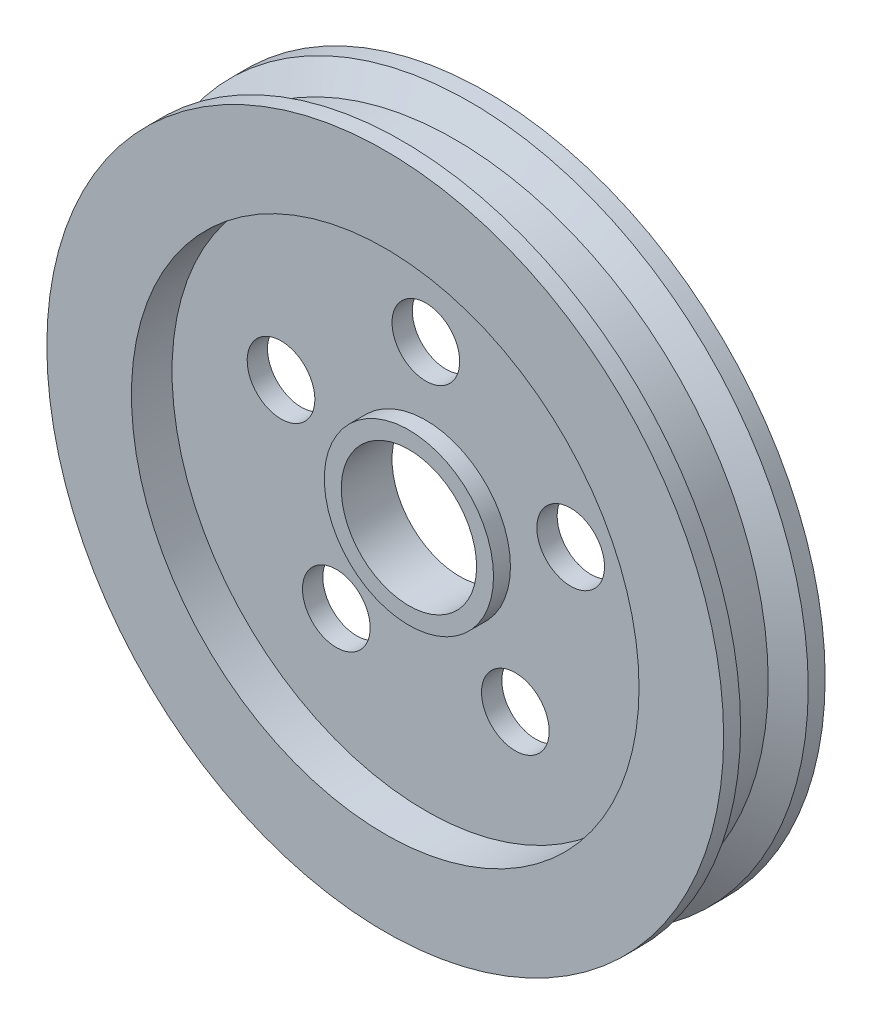
ISO-10303-21;
HEADER;
FILE_DESCRIPTION(('STEP AP214'),'2;1');
FILE_NAME('part.step','',(''),(''),'','','');
FILE_SCHEMA(('AUTOMOTIVE_DESIGN { 1 0 10303 214 1 1 1 1 }'));
ENDSEC;
DATA;
#1=APPLICATION_CONTEXT('core data for automotive mechanical design processes');
#2=APPLICATION_PROTOCOL_DEFINITION('international standard','automotive_design',2000,#1);
#3=PRODUCT_CONTEXT('',#1,'mechanical');
#4=PRODUCT('Part','Part','',(#3));
#5=PRODUCT_RELATED_PRODUCT_CATEGORY('part','',(#4));
#6=PRODUCT_DEFINITION_FORMATION('','',#4);
#7=PRODUCT_DEFINITION_CONTEXT('part definition',#1,'design');
#8=PRODUCT_DEFINITION('design','',#6,#7);
#9=PRODUCT_DEFINITION_SHAPE('','',#8);
#10=(LENGTH_UNIT() NAMED_UNIT(*) SI_UNIT(.MILLI.,.METRE.));
#11=(NAMED_UNIT(*) PLANE_ANGLE_UNIT() SI_UNIT($,.RADIAN.));
#12=(NAMED_UNIT(*) SI_UNIT($,.STERADIAN.) SOLID_ANGLE_UNIT());
#13=UNCERTAINTY_MEASURE_WITH_UNIT(LENGTH_MEASURE(1.E-05),#10,'distance_accuracy_value','');
#14=(GEOMETRIC_REPRESENTATION_CONTEXT(3) GLOBAL_UNCERTAINTY_ASSIGNED_CONTEXT((#13)) GLOBAL_UNIT_ASSIGNED_CONTEXT((#10,
#11,#12)) REPRESENTATION_CONTEXT('',''));
#15=CARTESIAN_POINT('',(0.,0.,0.));
#16=DIRECTION('',(0.,0.,1.));
#17=DIRECTION('',(1.,0.,0.));
#18=AXIS2_PLACEMENT_3D('',#15,#16,#17);
#19=CARTESIAN_POINT('',(0.,0.,3.));
#20=DIRECTION('',(0.,0.,-1.));
#21=DIRECTION('',(-1.,0.,0.));
#22=AXIS2_PLACEMENT_3D('',#19,#20,#21);
#23=CYLINDRICAL_SURFACE('',#22,20.);
#24=CARTESIAN_POINT('',(0.,0.,-2.));
#25=DIRECTION('',(0.,0.,1.));
#26=DIRECTION('',(1.,0.,0.));
#27=AXIS2_PLACEMENT_3D('',#24,#25,#26);
#28=CIRCLE('',#27,20.);
#29=CARTESIAN_POINT('',(20.,0.,-2.));
#30=VERTEX_POINT('',#29);
#31=EDGE_CURVE('E68',#30,#30,#28,.T.);
#32=ORIENTED_EDGE('',*,*,#31,.F.);
#33=EDGE_LOOP('',(#32));
#34=FACE_BOUND('',#33,.T.);
#35=CARTESIAN_POINT('',(0.,0.,-3.));
#36=DIRECTION('',(0.,0.,1.));
#37=DIRECTION('',(1.,0.,0.));
#38=AXIS2_PLACEMENT_3D('',#35,#36,#37);
#39=CIRCLE('',#38,20.);
#40=CARTESIAN_POINT('',(20.,0.,-3.));
#41=VERTEX_POINT('',#40);
#42=EDGE_CURVE('E108',#41,#41,#39,.T.);
#43=ORIENTED_EDGE('',*,*,#42,.T.);
#44=EDGE_LOOP('',(#43));
#45=FACE_BOUND('',#44,.T.);
#46=ADVANCED_FACE('F37',(#34,#45),#23,.T.);
#47=CARTESIAN_POINT('',(0.,0.,3.));
#48=DIRECTION('',(0.,0.,1.));
#49=DIRECTION('',(1.,0.,0.));
#50=AXIS2_PLACEMENT_3D('',#47,#48,#49);
#51=PLANE('',#50);
#52=CARTESIAN_POINT('',(0.,0.,3.));
#53=DIRECTION('',(0.,0.,1.));
#54=DIRECTION('',(1.,0.,0.));
#55=AXIS2_PLACEMENT_3D('',#52,#53,#54);
#56=CIRCLE('',#55,15.);
#57=CARTESIAN_POINT('',(15.,0.,3.));
#58=VERTEX_POINT('',#57);
#59=EDGE_CURVE('E99',#58,#58,#56,.T.);
#60=ORIENTED_EDGE('',*,*,#59,.F.);
#61=EDGE_LOOP('',(#60));
#62=FACE_BOUND('',#61,.T.);
#63=CARTESIAN_POINT('',(0.,0.,3.));
#64=DIRECTION('',(0.,0.,1.));
#65=DIRECTION('',(1.,0.,0.));
#66=AXIS2_PLACEMENT_3D('',#63,#64,#65);
#67=CIRCLE('',#66,20.);
#68=CARTESIAN_POINT('',(20.,0.,3.));
#69=VERTEX_POINT('',#68);
#70=EDGE_CURVE('E51',#69,#69,#67,.T.);
#71=ORIENTED_EDGE('',*,*,#70,.T.);
#72=EDGE_LOOP('',(#71));
#73=FACE_BOUND('',#72,.T.);
#74=ADVANCED_FACE('F164',(#62,#73),#51,.T.);
#75=CARTESIAN_POINT('',(0.,0.,-3.));
#76=DIRECTION('',(0.,0.,1.));
#77=DIRECTION('',(1.,0.,0.));
#78=AXIS2_PLACEMENT_3D('',#75,#76,#77);
#79=PLANE('',#78);
#80=CARTESIAN_POINT('',(0.,0.,-3.));
#81=DIRECTION('',(0.,0.,1.));
#82=DIRECTION('',(1.,0.,0.));
#83=AXIS2_PLACEMENT_3D('',#80,#81,#82);
#84=CIRCLE('',#83,15.);
#85=CARTESIAN_POINT('',(15.,0.,-3.));
#86=VERTEX_POINT('',#85);
#87=EDGE_CURVE('E100',#86,#86,#84,.T.);
#88=ORIENTED_EDGE('',*,*,#87,.T.);
#89=EDGE_LOOP('',(#88));
#90=FACE_BOUND('',#89,.T.);
#91=ORIENTED_EDGE('',*,*,#42,.F.);
#92=EDGE_LOOP('',(#91));
#93=FACE_BOUND('',#92,.T.);
#94=ADVANCED_FACE('F161',(#90,#93),#79,.F.);
#95=CARTESIAN_POINT('',(0.,0.,2.));
#96=DIRECTION('',(0.,0.,1.));
#97=DIRECTION('',(1.,0.,0.));
#98=AXIS2_PLACEMENT_3D('',#95,#96,#97);
#99=CIRCLE('',#98,20.);
#100=CARTESIAN_POINT('',(20.,0.,2.));
#101=VERTEX_POINT('',#100);
#102=EDGE_CURVE('E56',#101,#101,#99,.T.);
#103=ORIENTED_EDGE('',*,*,#102,.T.);
#104=EDGE_LOOP('',(#103));
#105=FACE_BOUND('',#104,.T.);
#106=ORIENTED_EDGE('',*,*,#70,.F.);
#107=EDGE_LOOP('',(#106));
#108=FACE_BOUND('',#107,.T.);
#109=ADVANCED_FACE('F39',(#105,#108),#23,.T.);
#110=CARTESIAN_POINT('',(0.,0.,0.6));
#111=DIRECTION('',(0.,0.,1.));
#112=DIRECTION('',(1.,0.,0.));
#113=AXIS2_PLACEMENT_3D('',#110,#111,#112);
#114=CYLINDRICAL_SURFACE('',#113,15.);
#115=CARTESIAN_POINT('',(0.,0.,0.6));
#116=DIRECTION('',(0.,0.,1.));
#117=DIRECTION('',(1.,0.,0.));
#118=AXIS2_PLACEMENT_3D('',#115,#116,#117);
#119=CIRCLE('',#118,15.);
#120=CARTESIAN_POINT('',(15.,0.,0.6));
#121=VERTEX_POINT('',#120);
#122=EDGE_CURVE('E104',#121,#121,#119,.T.);
#123=ORIENTED_EDGE('',*,*,#122,.F.);
#124=EDGE_LOOP('',(#123));
#125=FACE_BOUND('',#124,.T.);
#126=ORIENTED_EDGE('',*,*,#59,.T.);
#127=EDGE_LOOP('',(#126));
#128=FACE_BOUND('',#127,.T.);
#129=ADVANCED_FACE('F176',(#125,#128),#114,.F.);
#130=CARTESIAN_POINT('',(0.,0.,0.6));
#131=DIRECTION('',(0.,0.,1.));
#132=DIRECTION('',(1.,0.,0.));
#133=AXIS2_PLACEMENT_3D('',#130,#131,#132);
#134=PLANE('',#133);
#135=CARTESIAN_POINT('',(0.,0.,0.6));
#136=DIRECTION('',(0.,0.,1.));
#137=DIRECTION('',(1.,0.,0.));
#138=AXIS2_PLACEMENT_3D('',#135,#136,#137);
#139=CIRCLE('',#138,5.);
#140=CARTESIAN_POINT('',(5.,0.,0.6));
#141=VERTEX_POINT('',#140);
#142=EDGE_CURVE('E10',#141,#141,#139,.T.);
#143=ORIENTED_EDGE('',*,*,#142,.F.);
#144=EDGE_LOOP('',(#143));
#145=FACE_BOUND('',#144,.T.);
#146=CARTESIAN_POINT('',(8.55950864665635,2.78115294937462,0.6));
#147=DIRECTION('',(0.,0.,1.));
#148=DIRECTION('',(0.309016994374958,-0.95105651629515,0.));
#149=AXIS2_PLACEMENT_3D('',#146,#147,#148);
#150=CIRCLE('',#149,2.);
#151=CARTESIAN_POINT('',(9.17754263540627,0.879039916784324,0.6));
#152=VERTEX_POINT('',#151);
#153=EDGE_CURVE('E72',#152,#152,#150,.T.);
#154=ORIENTED_EDGE('',*,*,#153,.F.);
#155=EDGE_LOOP('',(#154));
#156=FACE_BOUND('',#155,.T.);
#157=CARTESIAN_POINT('',(5.29006727063232,-7.28115294937448,0.6));
#158=DIRECTION('',(0.,0.,1.));
#159=DIRECTION('',(-0.809016994374942,-0.58778525229248,0.));
#160=AXIS2_PLACEMENT_3D('',#157,#158,#159);
#161=CIRCLE('',#160,2.);
#162=CARTESIAN_POINT('',(3.67203328188244,-8.45672345395944,0.6));
#163=VERTEX_POINT('',#162);
#164=EDGE_CURVE('E78',#163,#163,#161,.T.);
#165=ORIENTED_EDGE('',*,*,#164,.F.);
#166=EDGE_LOOP('',(#165));
#167=FACE_BOUND('',#166,.T.);
#168=CARTESIAN_POINT('',(-5.29006727063222,-7.28115294937456,0.6));
#169=DIRECTION('',(0.,0.,1.));
#170=DIRECTION('',(-0.809016994374951,0.587785252292469,0.));
#171=AXIS2_PLACEMENT_3D('',#168,#169,#170);
#172=CIRCLE('',#171,2.);
#173=CARTESIAN_POINT('',(-6.90810125938212,-6.10558244478962,0.6));
#174=VERTEX_POINT('',#173);
#175=EDGE_CURVE('E73',#174,#174,#172,.T.);
#176=ORIENTED_EDGE('',*,*,#175,.F.);
#177=EDGE_LOOP('',(#176));
#178=FACE_BOUND('',#177,.T.);
#179=CARTESIAN_POINT('',(-8.55950864665639,2.7811529493745,0.6));
#180=DIRECTION('',(0.,0.,1.));
#181=DIRECTION('',(0.309016994374945,0.951056516295155,0.));
#182=AXIS2_PLACEMENT_3D('',#179,#180,#181);
#183=CIRCLE('',#182,2.);
#184=CARTESIAN_POINT('',(-7.9414746579065,4.68326598196481,0.6));
#185=VERTEX_POINT('',#184);
#186=EDGE_CURVE('E77',#185,#185,#183,.T.);
#187=ORIENTED_EDGE('',*,*,#186,.F.);
#188=EDGE_LOOP('',(#187));
#189=FACE_BOUND('',#188,.T.);
#190=CARTESIAN_POINT('',(0.,9.,0.6));
#191=DIRECTION('',(0.,0.,1.));
#192=DIRECTION('',(1.,0.,0.));
#193=AXIS2_PLACEMENT_3D('',#190,#191,#192);
#194=CIRCLE('',#193,2.);
#195=CARTESIAN_POINT('',(2.,9.,0.6));
#196=VERTEX_POINT('',#195);
#197=EDGE_CURVE('E89',#196,#196,#194,.T.);
#198=ORIENTED_EDGE('',*,*,#197,.F.);
#199=EDGE_LOOP('',(#198));
#200=FACE_BOUND('',#199,.T.);
#201=ORIENTED_EDGE('',*,*,#122,.T.);
#202=EDGE_LOOP('',(#201));
#203=FACE_BOUND('',#202,.T.);
#204=ADVANCED_FACE('F157',(#145,#156,#167,#178,#189,#200,#203),#134,.T.);
#205=CARTESIAN_POINT('',(0.,0.,-0.6));
#206=DIRECTION('',(0.,0.,-1.));
#207=DIRECTION('',(-1.,0.,0.));
#208=AXIS2_PLACEMENT_3D('',#205,#206,#207);
#209=CYLINDRICAL_SURFACE('',#208,15.);
#210=CARTESIAN_POINT('',(0.,0.,-0.6));
#211=DIRECTION('',(0.,0.,1.));
#212=DIRECTION('',(1.,0.,0.));
#213=AXIS2_PLACEMENT_3D('',#210,#211,#212);
#214=CIRCLE('',#213,15.);
#215=CARTESIAN_POINT('',(15.,0.,-0.6));
#216=VERTEX_POINT('',#215);
#217=EDGE_CURVE('E95',#216,#216,#214,.T.);
#218=ORIENTED_EDGE('',*,*,#217,.T.);
#219=EDGE_LOOP('',(#218));
#220=FACE_BOUND('',#219,.T.);
#221=ORIENTED_EDGE('',*,*,#87,.F.);
#222=EDGE_LOOP('',(#221));
#223=FACE_BOUND('',#222,.T.);
#224=ADVANCED_FACE('F142',(#220,#223),#209,.F.);
#225=CARTESIAN_POINT('',(0.,0.,-0.6));
#226=DIRECTION('',(0.,0.,-1.));
#227=DIRECTION('',(1.,0.,0.));
#228=AXIS2_PLACEMENT_3D('',#225,#226,#227);
#229=PLANE('',#228);
#230=CARTESIAN_POINT('',(0.,0.,-0.6));
#231=DIRECTION('',(0.,0.,-1.));
#232=DIRECTION('',(-1.,0.,0.));
#233=AXIS2_PLACEMENT_3D('',#230,#231,#232);
#234=CIRCLE('',#233,5.);
#235=CARTESIAN_POINT('',(-5.,0.,-0.6));
#236=VERTEX_POINT('',#235);
#237=EDGE_CURVE('E41',#236,#236,#234,.T.);
#238=ORIENTED_EDGE('',*,*,#237,.F.);
#239=EDGE_LOOP('',(#238));
#240=FACE_BOUND('',#239,.T.);
#241=CARTESIAN_POINT('',(8.55950864665635,2.78115294937462,-0.6));
#242=DIRECTION('',(0.,0.,-1.));
#243=DIRECTION('',(-1.,0.,0.));
#244=AXIS2_PLACEMENT_3D('',#241,#242,#243);
#245=CIRCLE('',#244,2.);
#246=CARTESIAN_POINT('',(6.55950864665635,2.78115294937462,-0.6));
#247=VERTEX_POINT('',#246);
#248=EDGE_CURVE('E94',#247,#247,#245,.T.);
#249=ORIENTED_EDGE('',*,*,#248,.F.);
#250=EDGE_LOOP('',(#249));
#251=FACE_BOUND('',#250,.T.);
#252=CARTESIAN_POINT('',(5.29006727063232,-7.28115294937448,-0.6));
#253=DIRECTION('',(0.,0.,-1.));
#254=DIRECTION('',(-1.,0.,0.));
#255=AXIS2_PLACEMENT_3D('',#252,#253,#254);
#256=CIRCLE('',#255,2.);
#257=CARTESIAN_POINT('',(3.29006727063232,-7.28115294937448,-0.6));
#258=VERTEX_POINT('',#257);
#259=EDGE_CURVE('E128',#258,#258,#256,.T.);
#260=ORIENTED_EDGE('',*,*,#259,.F.);
#261=EDGE_LOOP('',(#260));
#262=FACE_BOUND('',#261,.T.);
#263=CARTESIAN_POINT('',(-5.29006727063222,-7.28115294937456,-0.6));
#264=DIRECTION('',(0.,0.,-1.));
#265=DIRECTION('',(-1.,0.,0.));
#266=AXIS2_PLACEMENT_3D('',#263,#264,#265);
#267=CIRCLE('',#266,2.);
#268=CARTESIAN_POINT('',(-7.29006727063222,-7.28115294937456,-0.6));
#269=VERTEX_POINT('',#268);
#270=EDGE_CURVE('E124',#269,#269,#267,.T.);
#271=ORIENTED_EDGE('',*,*,#270,.F.);
#272=EDGE_LOOP('',(#271));
#273=FACE_BOUND('',#272,.T.);
#274=CARTESIAN_POINT('',(-8.55950864665639,2.7811529493745,-0.6));
#275=DIRECTION('',(0.,0.,-1.));
#276=DIRECTION('',(-1.,0.,0.));
#277=AXIS2_PLACEMENT_3D('',#274,#275,#276);
#278=CIRCLE('',#277,2.);
#279=CARTESIAN_POINT('',(-10.5595086466564,2.7811529493745,-0.6));
#280=VERTEX_POINT('',#279);
#281=EDGE_CURVE('E88',#280,#280,#278,.T.);
#282=ORIENTED_EDGE('',*,*,#281,.F.);
#283=EDGE_LOOP('',(#282));
#284=FACE_BOUND('',#283,.T.);
#285=CARTESIAN_POINT('',(0.,9.,-0.6));
#286=DIRECTION('',(0.,0.,-1.));
#287=DIRECTION('',(-1.,0.,0.));
#288=AXIS2_PLACEMENT_3D('',#285,#286,#287);
#289=CIRCLE('',#288,2.);
#290=CARTESIAN_POINT('',(-2.,9.,-0.6));
#291=VERTEX_POINT('',#290);
#292=EDGE_CURVE('E93',#291,#291,#289,.T.);
#293=ORIENTED_EDGE('',*,*,#292,.F.);
#294=EDGE_LOOP('',(#293));
#295=FACE_BOUND('',#294,.T.);
#296=ORIENTED_EDGE('',*,*,#217,.F.);
#297=EDGE_LOOP('',(#296));
#298=FACE_BOUND('',#297,.T.);
#299=ADVANCED_FACE('F138',(#240,#251,#262,#273,#284,#295,#298),#229,.T.);
#300=CARTESIAN_POINT('',(0.,9.,-3.));
#301=DIRECTION('',(0.,0.,1.));
#302=DIRECTION('',(1.,0.,0.));
#303=AXIS2_PLACEMENT_3D('',#300,#301,#302);
#304=CYLINDRICAL_SURFACE('',#303,2.);
#305=ORIENTED_EDGE('',*,*,#292,.T.);
#306=EDGE_LOOP('',(#305));
#307=FACE_BOUND('',#306,.T.);
#308=ORIENTED_EDGE('',*,*,#197,.T.);
#309=EDGE_LOOP('',(#308));
#310=FACE_BOUND('',#309,.T.);
#311=ADVANCED_FACE('F141',(#307,#310),#304,.F.);
#312=CARTESIAN_POINT('',(-8.55950864665639,2.7811529493745,-3.));
#313=DIRECTION('',(0.,0.,1.));
#314=DIRECTION('',(1.,0.,0.));
#315=AXIS2_PLACEMENT_3D('',#312,#313,#314);
#316=CYLINDRICAL_SURFACE('',#315,2.);
#317=ORIENTED_EDGE('',*,*,#281,.T.);
#318=EDGE_LOOP('',(#317));
#319=FACE_BOUND('',#318,.T.);
#320=ORIENTED_EDGE('',*,*,#186,.T.);
#321=EDGE_LOOP('',(#320));
#322=FACE_BOUND('',#321,.T.);
#323=ADVANCED_FACE('F214',(#319,#322),#316,.F.);
#324=CARTESIAN_POINT('',(-5.29006727063222,-7.28115294937456,-3.));
#325=DIRECTION('',(0.,0.,1.));
#326=DIRECTION('',(1.,0.,0.));
#327=AXIS2_PLACEMENT_3D('',#324,#325,#326);
#328=CYLINDRICAL_SURFACE('',#327,2.);
#329=ORIENTED_EDGE('',*,*,#270,.T.);
#330=EDGE_LOOP('',(#329));
#331=FACE_BOUND('',#330,.T.);
#332=ORIENTED_EDGE('',*,*,#175,.T.);
#333=EDGE_LOOP('',(#332));
#334=FACE_BOUND('',#333,.T.);
#335=ADVANCED_FACE('F211',(#331,#334),#328,.F.);
#336=CARTESIAN_POINT('',(5.29006727063232,-7.28115294937448,-3.));
#337=DIRECTION('',(0.,0.,1.));
#338=DIRECTION('',(1.,0.,0.));
#339=AXIS2_PLACEMENT_3D('',#336,#337,#338);
#340=CYLINDRICAL_SURFACE('',#339,2.);
#341=ORIENTED_EDGE('',*,*,#259,.T.);
#342=EDGE_LOOP('',(#341));
#343=FACE_BOUND('',#342,.T.);
#344=ORIENTED_EDGE('',*,*,#164,.T.);
#345=EDGE_LOOP('',(#344));
#346=FACE_BOUND('',#345,.T.);
#347=ADVANCED_FACE('F208',(#343,#346),#340,.F.);
#348=CARTESIAN_POINT('',(8.55950864665635,2.78115294937462,-3.));
#349=DIRECTION('',(0.,0.,1.));
#350=DIRECTION('',(1.,0.,0.));
#351=AXIS2_PLACEMENT_3D('',#348,#349,#350);
#352=CYLINDRICAL_SURFACE('',#351,2.);
#353=ORIENTED_EDGE('',*,*,#248,.T.);
#354=EDGE_LOOP('',(#353));
#355=FACE_BOUND('',#354,.T.);
#356=ORIENTED_EDGE('',*,*,#153,.T.);
#357=EDGE_LOOP('',(#356));
#358=FACE_BOUND('',#357,.T.);
#359=ADVANCED_FACE('F135',(#355,#358),#352,.F.);
#360=CARTESIAN_POINT('',(0.,0.,-2.));
#361=DIRECTION('',(0.,0.,-1.));
#362=DIRECTION('',(-1.,0.,0.));
#363=AXIS2_PLACEMENT_3D('',#360,#361,#362);
#364=CONICAL_SURFACE('',#363,20.,1.04719755119659);
#365=CARTESIAN_POINT('',(0.,0.,-1.13397459621555));
#366=DIRECTION('',(0.,0.,1.));
#367=DIRECTION('',(1.,0.,0.));
#368=AXIS2_PLACEMENT_3D('',#365,#366,#367);
#369=CIRCLE('',#368,18.5);
#370=CARTESIAN_POINT('',(18.5,0.,-1.13397459621555));
#371=VERTEX_POINT('',#370);
#372=EDGE_CURVE('E64',#371,#371,#369,.T.);
#373=ORIENTED_EDGE('',*,*,#372,.F.);
#374=EDGE_LOOP('',(#373));
#375=FACE_BOUND('',#374,.T.);
#376=ORIENTED_EDGE('',*,*,#31,.T.);
#377=EDGE_LOOP('',(#376));
#378=FACE_BOUND('',#377,.T.);
#379=ADVANCED_FACE('F198',(#375,#378),#364,.T.);
#380=CARTESIAN_POINT('',(0.,0.,0.));
#381=DIRECTION('',(0.,0.,1.));
#382=DIRECTION('',(1.,0.,0.));
#383=AXIS2_PLACEMENT_3D('',#380,#381,#382);
#384=CYLINDRICAL_SURFACE('',#383,18.5);
#385=CARTESIAN_POINT('',(0.,0.,1.13397459621555));
#386=DIRECTION('',(0.,0.,1.));
#387=DIRECTION('',(1.,0.,0.));
#388=AXIS2_PLACEMENT_3D('',#385,#386,#387);
#389=CIRCLE('',#388,18.5);
#390=CARTESIAN_POINT('',(18.5,0.,1.13397459621555));
#391=VERTEX_POINT('',#390);
#392=EDGE_CURVE('E60',#391,#391,#389,.T.);
#393=ORIENTED_EDGE('',*,*,#392,.F.);
#394=EDGE_LOOP('',(#393));
#395=FACE_BOUND('',#394,.T.);
#396=ORIENTED_EDGE('',*,*,#372,.T.);
#397=EDGE_LOOP('',(#396));
#398=FACE_BOUND('',#397,.T.);
#399=ADVANCED_FACE('F192',(#395,#398),#384,.T.);
#400=CARTESIAN_POINT('',(0.,0.,1.13397459621555));
#401=DIRECTION('',(0.,0.,1.));
#402=DIRECTION('',(1.,0.,0.));
#403=AXIS2_PLACEMENT_3D('',#400,#401,#402);
#404=CONICAL_SURFACE('',#403,18.5,1.04719755119659);
#405=ORIENTED_EDGE('',*,*,#102,.F.);
#406=EDGE_LOOP('',(#405));
#407=FACE_BOUND('',#406,.T.);
#408=ORIENTED_EDGE('',*,*,#392,.T.);
#409=EDGE_LOOP('',(#408));
#410=FACE_BOUND('',#409,.T.);
#411=ADVANCED_FACE('F188',(#407,#410),#404,.T.);
#412=CARTESIAN_POINT('',(0.,0.,-1.4));
#413=DIRECTION('',(0.,0.,1.));
#414=DIRECTION('',(1.,0.,0.));
#415=AXIS2_PLACEMENT_3D('',#412,#413,#414);
#416=PLANE('',#415);
#417=CARTESIAN_POINT('',(0.,0.,-1.4));
#418=DIRECTION('',(0.,0.,1.));
#419=DIRECTION('',(1.,0.,0.));
#420=AXIS2_PLACEMENT_3D('',#417,#418,#419);
#421=CIRCLE('',#420,4.);
#422=CARTESIAN_POINT('',(4.,0.,-1.4));
#423=VERTEX_POINT('',#422);
#424=EDGE_CURVE('E361',#423,#423,#421,.T.);
#425=ORIENTED_EDGE('',*,*,#424,.T.);
#426=EDGE_LOOP('',(#425));
#427=FACE_BOUND('',#426,.T.);
#428=CARTESIAN_POINT('',(0.,0.,-1.4));
#429=DIRECTION('',(0.,0.,1.));
#430=DIRECTION('',(1.,0.,0.));
#431=AXIS2_PLACEMENT_3D('',#428,#429,#430);
#432=CIRCLE('',#431,5.);
#433=CARTESIAN_POINT('',(5.,0.,-1.4));
#434=VERTEX_POINT('',#433);
#435=EDGE_CURVE('E54',#434,#434,#432,.T.);
#436=ORIENTED_EDGE('',*,*,#435,.F.);
#437=EDGE_LOOP('',(#436));
#438=FACE_BOUND('',#437,.T.);
#439=ADVANCED_FACE('F191',(#427,#438),#416,.F.);
#440=CARTESIAN_POINT('',(0.,0.,-1.4));
#441=DIRECTION('',(0.,0.,1.));
#442=DIRECTION('',(1.,0.,0.));
#443=AXIS2_PLACEMENT_3D('',#440,#441,#442);
#444=CYLINDRICAL_SURFACE('',#443,5.);
#445=ORIENTED_EDGE('',*,*,#237,.T.);
#446=EDGE_LOOP('',(#445));
#447=FACE_BOUND('',#446,.T.);
#448=ORIENTED_EDGE('',*,*,#435,.T.);
#449=EDGE_LOOP('',(#448));
#450=FACE_BOUND('',#449,.T.);
#451=ADVANCED_FACE('F314',(#447,#450),#444,.T.);
#452=ORIENTED_EDGE('',*,*,#142,.T.);
#453=EDGE_LOOP('',(#452));
#454=FACE_BOUND('',#453,.T.);
#455=CARTESIAN_POINT('',(0.,0.,1.6));
#456=DIRECTION('',(0.,0.,1.));
#457=DIRECTION('',(1.,0.,0.));
#458=AXIS2_PLACEMENT_3D('',#455,#456,#457);
#459=CIRCLE('',#458,5.);
#460=CARTESIAN_POINT('',(5.,0.,1.6));
#461=VERTEX_POINT('',#460);
#462=EDGE_CURVE('E363',#461,#461,#459,.T.);
#463=ORIENTED_EDGE('',*,*,#462,.F.);
#464=EDGE_LOOP('',(#463));
#465=FACE_BOUND('',#464,.T.);
#466=ADVANCED_FACE('F322',(#454,#465),#444,.T.);
#467=CARTESIAN_POINT('',(0.,0.,1.6));
#468=DIRECTION('',(0.,0.,1.));
#469=DIRECTION('',(1.,0.,0.));
#470=AXIS2_PLACEMENT_3D('',#467,#468,#469);
#471=PLANE('',#470);
#472=CARTESIAN_POINT('',(0.,0.,1.6));
#473=DIRECTION('',(0.,0.,1.));
#474=DIRECTION('',(1.,0.,0.));
#475=AXIS2_PLACEMENT_3D('',#472,#473,#474);
#476=CIRCLE('',#475,4.);
#477=CARTESIAN_POINT('',(4.,0.,1.6));
#478=VERTEX_POINT('',#477);
#479=EDGE_CURVE('E358',#478,#478,#476,.T.);
#480=ORIENTED_EDGE('',*,*,#479,.F.);
#481=EDGE_LOOP('',(#480));
#482=FACE_BOUND('',#481,.T.);
#483=ORIENTED_EDGE('',*,*,#462,.T.);
#484=EDGE_LOOP('',(#483));
#485=FACE_BOUND('',#484,.T.);
#486=ADVANCED_FACE('F329',(#482,#485),#471,.T.);
#487=CARTESIAN_POINT('',(0.,0.,-3.));
#488=DIRECTION('',(0.,0.,1.));
#489=DIRECTION('',(1.,0.,0.));
#490=AXIS2_PLACEMENT_3D('',#487,#488,#489);
#491=CYLINDRICAL_SURFACE('',#490,4.);
#492=ORIENTED_EDGE('',*,*,#479,.T.);
#493=EDGE_LOOP('',(#492));
#494=FACE_BOUND('',#493,.T.);
#495=ORIENTED_EDGE('',*,*,#424,.F.);
#496=EDGE_LOOP('',(#495));
#497=FACE_BOUND('',#496,.T.);
#498=ADVANCED_FACE('F334',(#494,#497),#491,.F.);
#499=CLOSED_SHELL('',(#46,#74,#94,#109,#129,#204,#224,#299,#311,#323,#335,#347,#359,#379,#399,
#411,#439,#451,#466,#486,#498));
#500=MANIFOLD_SOLID_BREP('B2',#499);
#501=ADVANCED_BREP_SHAPE_REPRESENTATION('',(#18,#500),#14);
#502=SHAPE_DEFINITION_REPRESENTATION(#9,#501);
ENDSEC;
END-ISO-10303-21;
